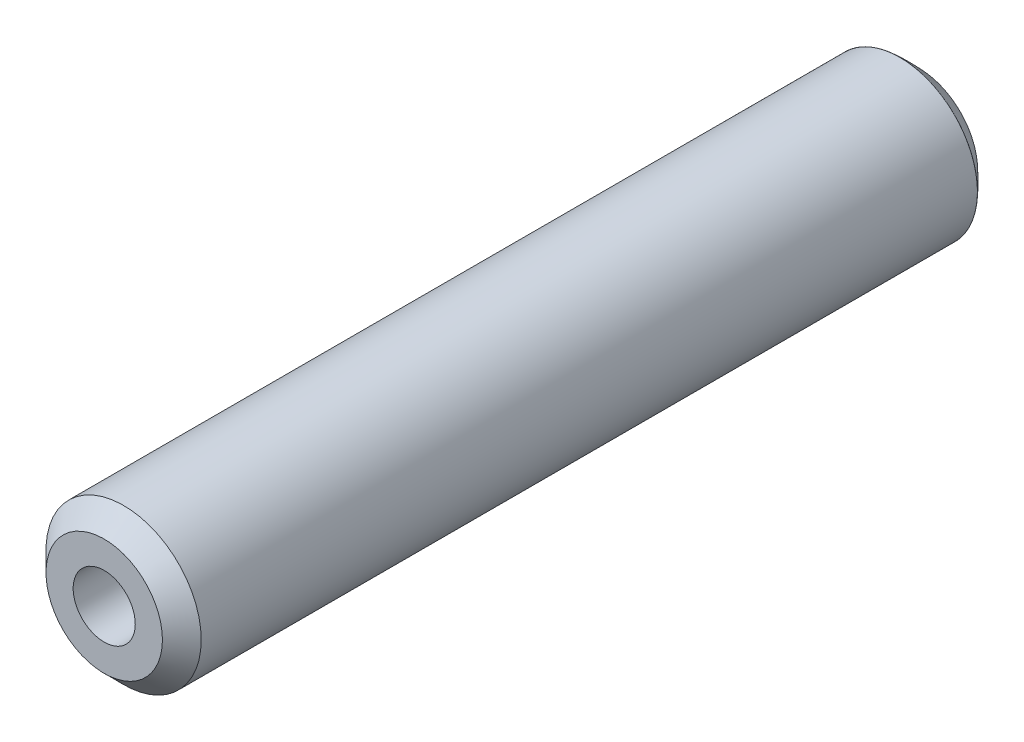
ISO-10303-21;
HEADER;
FILE_DESCRIPTION(('STEP AP214'),'2;1');
FILE_NAME('part.step','',(''),(''),'','','');
FILE_SCHEMA(('AUTOMOTIVE_DESIGN { 1 0 10303 214 1 1 1 1 }'));
ENDSEC;
DATA;
#1=APPLICATION_CONTEXT('core data for automotive mechanical design processes');
#2=APPLICATION_PROTOCOL_DEFINITION('international standard','automotive_design',2000,#1);
#3=PRODUCT_CONTEXT('',#1,'mechanical');
#4=PRODUCT('Part','Part','',(#3));
#5=PRODUCT_RELATED_PRODUCT_CATEGORY('part','',(#4));
#6=PRODUCT_DEFINITION_FORMATION('','',#4);
#7=PRODUCT_DEFINITION_CONTEXT('part definition',#1,'design');
#8=PRODUCT_DEFINITION('design','',#6,#7);
#9=PRODUCT_DEFINITION_SHAPE('','',#8);
#10=(LENGTH_UNIT() NAMED_UNIT(*) SI_UNIT(.MILLI.,.METRE.));
#11=(NAMED_UNIT(*) PLANE_ANGLE_UNIT() SI_UNIT($,.RADIAN.));
#12=(NAMED_UNIT(*) SI_UNIT($,.STERADIAN.) SOLID_ANGLE_UNIT());
#13=UNCERTAINTY_MEASURE_WITH_UNIT(LENGTH_MEASURE(1.E-05),#10,'distance_accuracy_value','');
#14=(GEOMETRIC_REPRESENTATION_CONTEXT(3) GLOBAL_UNCERTAINTY_ASSIGNED_CONTEXT((#13)) GLOBAL_UNIT_ASSIGNED_CONTEXT((#10,
#11,#12)) REPRESENTATION_CONTEXT('',''));
#15=CARTESIAN_POINT('',(0.,0.,0.));
#16=DIRECTION('',(0.,0.,1.));
#17=DIRECTION('',(1.,0.,0.));
#18=AXIS2_PLACEMENT_3D('',#15,#16,#17);
#19=CARTESIAN_POINT('',(-15.,-17.5,-8.));
#20=DIRECTION('',(0.,0.,1.));
#21=DIRECTION('',(1.,0.,0.));
#22=AXIS2_PLACEMENT_3D('',#19,#20,#21);
#23=CYLINDRICAL_SURFACE('',#22,2.);
#24=CARTESIAN_POINT('',(-13.,-17.5,2.5));
#25=CARTESIAN_POINT('',(-12.9999999470683,-17.5327241974965,2.5));
#26=CARTESIAN_POINT('',(-13.0008133145145,-17.5654477404733,2.5));
#27=CARTESIAN_POINT('',(-13.0040514588773,-17.6308145667304,2.5));
#28=CARTESIAN_POINT('',(-13.0064762098141,-17.6634578512962,2.5));
#29=CARTESIAN_POINT('',(-13.0129217490919,-17.728586858663,2.5));
#30=CARTESIAN_POINT('',(-13.0169425662685,-17.7610725786067,2.5));
#31=CARTESIAN_POINT('',(-13.0265648763823,-17.8258096124799,2.5));
#32=CARTESIAN_POINT('',(-13.0321663972611,-17.8580609222555,2.5));
#33=CARTESIAN_POINT('',(-13.0449348270466,-17.9222521602081,2.5));
#34=CARTESIAN_POINT('',(-13.0521017359533,-17.9541920883852,2.5));
#35=CARTESIAN_POINT('',(-13.0679856784994,-18.0176836192475,2.5));
#36=CARTESIAN_POINT('',(-13.0767026847343,-18.0492352287873,2.5));
#37=CARTESIAN_POINT('',(-13.0956715471788,-18.1118731398176,2.5));
#38=CARTESIAN_POINT('',(-13.1059233756553,-18.1429594497045,2.5));
#39=CARTESIAN_POINT('',(-13.1279466255026,-18.204589882949,2.5));
#40=CARTESIAN_POINT('',(-13.1397180713705,-18.2351339975571,2.5));
#41=CARTESIAN_POINT('',(-13.1647637985844,-18.2955997319033,2.5));
#42=CARTESIAN_POINT('',(-13.1780380799305,-18.3255213516415,2.5));
#43=CARTESIAN_POINT('',(-13.2060445879555,-18.3846734382671,2.5));
#44=CARTESIAN_POINT('',(-13.2207767911255,-18.4139039162898,2.5));
#45=CARTESIAN_POINT('',(-13.2516554712828,-18.4716086190359,2.5));
#46=CARTESIAN_POINT('',(-13.2678019738175,-18.5000828300863,2.5));
#47=CARTESIAN_POINT('',(-13.3014656231934,-18.5562097662276,2.5));
#48=CARTESIAN_POINT('',(-13.3189827942595,-18.5838624767875,2.5));
#49=CARTESIAN_POINT('',(-13.3553442074814,-18.6382811773542,2.5));
#50=CARTESIAN_POINT('',(-13.3741884496371,-18.6650471673609,2.5));
#51=CARTESIAN_POINT('',(-13.413160456272,-18.7176271725797,2.5));
#52=CARTESIAN_POINT('',(-13.4332881980557,-18.7434412046119,2.5));
#53=CARTESIAN_POINT('',(-13.4747836325416,-18.7940520189103,2.5));
#54=CARTESIAN_POINT('',(-13.4961513028349,-18.8188488195468,2.5));
#55=CARTESIAN_POINT('',(-13.5400830783593,-18.867359982631,2.5));
#56=CARTESIAN_POINT('',(-13.5626472028745,-18.8910743276207,2.5));
#57=CARTESIAN_POINT('',(-13.6089256723793,-18.9373527971255,2.5));
#58=CARTESIAN_POINT('',(-13.632640017369,-18.9599169216407,2.5));
#59=CARTESIAN_POINT('',(-13.6811511804532,-19.0038486971651,2.5));
#60=CARTESIAN_POINT('',(-13.7059479810897,-19.0252163674584,2.5));
#61=CARTESIAN_POINT('',(-13.7565587953881,-19.0667118019444,2.5));
#62=CARTESIAN_POINT('',(-13.7823728274204,-19.0868395437281,2.5));
#63=CARTESIAN_POINT('',(-13.8349528326392,-19.1258115503629,2.5));
#64=CARTESIAN_POINT('',(-13.8617188226459,-19.1446557925186,2.5));
#65=CARTESIAN_POINT('',(-13.9161375232125,-19.1810172057405,2.5));
#66=CARTESIAN_POINT('',(-13.9437902337723,-19.1985343768067,2.5));
#67=CARTESIAN_POINT('',(-13.999917169914,-19.2321980261825,2.5));
#68=CARTESIAN_POINT('',(-14.0283913809649,-19.2483445287172,2.5));
#69=CARTESIAN_POINT('',(-14.0860960837096,-19.2792232088746,2.5));
#70=CARTESIAN_POINT('',(-14.1153265617303,-19.2939554120449,2.5));
#71=CARTESIAN_POINT('',(-14.1744786483612,-19.3219619200691,2.5));
#72=CARTESIAN_POINT('',(-14.2044002681068,-19.3352362014142,2.5));
#73=CARTESIAN_POINT('',(-14.2648660024329,-19.3602819286309,2.5));
#74=CARTESIAN_POINT('',(-14.2954101170135,-19.3720533745026,2.5));
#75=CARTESIAN_POINT('',(-14.3570405503329,-19.3940766243394,2.5));
#76=CARTESIAN_POINT('',(-14.3881268603222,-19.4043284528016,2.5));
#77=CARTESIAN_POINT('',(-14.4507647710728,-19.4232973152853,2.5));
#78=CARTESIAN_POINT('',(-14.4823163802305,-19.4320143215736,2.5));
#79=CARTESIAN_POINT('',(-14.5458079121367,-19.4478982639735,2.5));
#80=CARTESIAN_POINT('',(-14.5777478417398,-19.4550651726805,2.5));
#81=CARTESIAN_POINT('',(-14.6419390757965,-19.4678336030117,2.5));
#82=CARTESIAN_POINT('',(-14.6741903802501,-19.473435124636,2.5));
#83=CARTESIAN_POINT('',(-14.7389274286631,-19.4830574327131,2.5));
#84=CARTESIAN_POINT('',(-14.7714131684681,-19.4870782471077,2.5));
#85=CARTESIAN_POINT('',(-14.8365421215731,-19.4935237939862,2.5));
#86=CARTESIAN_POINT('',(-14.8691853320174,-19.4959485553054,2.5));
#87=CARTESIAN_POINT('',(-14.9345523607804,-19.4991866713026,2.5));
#88=CARTESIAN_POINT('',(-14.9672761803902,-19.5,2.5));
#89=CARTESIAN_POINT('',(-15.0327238196098,-19.5,2.5));
#90=CARTESIAN_POINT('',(-15.0654476392196,-19.4991866713026,2.5));
#91=CARTESIAN_POINT('',(-15.1308146679825,-19.4959485553054,2.5));
#92=CARTESIAN_POINT('',(-15.1634578784269,-19.4935237939862,2.5));
#93=CARTESIAN_POINT('',(-15.2285868315319,-19.4870782471077,2.5));
#94=CARTESIAN_POINT('',(-15.2610725713369,-19.4830574327131,2.5));
#95=CARTESIAN_POINT('',(-15.3258096197499,-19.473435124636,2.5));
#96=CARTESIAN_POINT('',(-15.3580609242035,-19.4678336030117,2.5));
#97=CARTESIAN_POINT('',(-15.4222521582602,-19.4550651726805,2.5));
#98=CARTESIAN_POINT('',(-15.4541920878634,-19.4478982639735,2.5));
#99=CARTESIAN_POINT('',(-15.5176836197695,-19.4320143215736,2.5));
#100=CARTESIAN_POINT('',(-15.5492352289273,-19.4232973152853,2.5));
#101=CARTESIAN_POINT('',(-15.6118731396778,-19.4043284528016,2.5));
#102=CARTESIAN_POINT('',(-15.6429594496671,-19.3940766243394,2.5));
#103=CARTESIAN_POINT('',(-15.7045898829865,-19.3720533745026,2.5));
#104=CARTESIAN_POINT('',(-15.7351339975671,-19.3602819286309,2.5));
#105=CARTESIAN_POINT('',(-15.7955997318932,-19.3352362014142,2.5));
#106=CARTESIAN_POINT('',(-15.8255213516387,-19.3219619200691,2.5));
#107=CARTESIAN_POINT('',(-15.8846734382697,-19.2939554120449,2.5));
#108=CARTESIAN_POINT('',(-15.9139039162904,-19.2792232088746,2.5));
#109=CARTESIAN_POINT('',(-15.9716086190351,-19.2483445287171,2.5));
#110=CARTESIAN_POINT('',(-16.0000828300861,-19.2321980261824,2.5));
#111=CARTESIAN_POINT('',(-16.0562097662278,-19.1985343768065,2.5));
#112=CARTESIAN_POINT('',(-16.0838624767876,-19.1810172057404,2.5));
#113=CARTESIAN_POINT('',(-16.1382811773542,-19.1446557925184,2.5));
#114=CARTESIAN_POINT('',(-16.165047167361,-19.1258115503627,2.5));
#115=CARTESIAN_POINT('',(-16.2176271725798,-19.0868395437278,2.5));
#116=CARTESIAN_POINT('',(-16.2434412046121,-19.0667118019442,2.5));
#117=CARTESIAN_POINT('',(-16.2940520189105,-19.0252163674582,2.5));
#118=CARTESIAN_POINT('',(-16.3188488195469,-19.003848697165,2.5));
#119=CARTESIAN_POINT('',(-16.3673599826311,-18.9599169216406,2.5));
#120=CARTESIAN_POINT('',(-16.3910743276207,-18.9373527971255,2.5));
#121=CARTESIAN_POINT('',(-16.4373527971255,-18.8910743276207,2.5));
#122=CARTESIAN_POINT('',(-16.4599169216406,-18.8673599826311,2.5));
#123=CARTESIAN_POINT('',(-16.5038486971649,-18.818848819547,2.5));
#124=CARTESIAN_POINT('',(-16.5252163674582,-18.7940520189105,2.5));
#125=CARTESIAN_POINT('',(-16.5667118019441,-18.7434412046122,2.5));
#126=CARTESIAN_POINT('',(-16.5868395437278,-18.7176271725799,2.5));
#127=CARTESIAN_POINT('',(-16.6258115503626,-18.6650471673611,2.5));
#128=CARTESIAN_POINT('',(-16.6446557925184,-18.6382811773543,2.5));
#129=CARTESIAN_POINT('',(-16.6810172057403,-18.5838624767878,2.5));
#130=CARTESIAN_POINT('',(-16.6985343768065,-18.5562097662279,2.5));
#131=CARTESIAN_POINT('',(-16.7321980261823,-18.5000828300862,2.5));
#132=CARTESIAN_POINT('',(-16.748344528717,-18.4716086190353,2.5));
#133=CARTESIAN_POINT('',(-16.7792232088745,-18.4139039162905,2.5));
#134=CARTESIAN_POINT('',(-16.7939554120448,-18.3846734382698,2.5));
#135=CARTESIAN_POINT('',(-16.8219619200691,-18.3255213516388,2.5));
#136=CARTESIAN_POINT('',(-16.8352362014142,-18.2955997318933,2.5));
#137=CARTESIAN_POINT('',(-16.8602819286309,-18.2351339975671,2.5));
#138=CARTESIAN_POINT('',(-16.8720533745026,-18.2045898829865,2.5));
#139=CARTESIAN_POINT('',(-16.8940766243394,-18.142959449667,2.5));
#140=CARTESIAN_POINT('',(-16.9043284528016,-18.1118731396777,2.5));
#141=CARTESIAN_POINT('',(-16.9232973152853,-18.0492352289272,2.5));
#142=CARTESIAN_POINT('',(-16.9320143215737,-18.0176836197694,2.5));
#143=CARTESIAN_POINT('',(-16.9478982639735,-17.9541920878632,2.5));
#144=CARTESIAN_POINT('',(-16.9550651726805,-17.9222521582601,2.5));
#145=CARTESIAN_POINT('',(-16.9678336030117,-17.8580609242034,2.5));
#146=CARTESIAN_POINT('',(-16.973435124636,-17.8258096197499,2.5));
#147=CARTESIAN_POINT('',(-16.9830574327131,-17.7610725713369,2.5));
#148=CARTESIAN_POINT('',(-16.9870782471077,-17.7285868315319,2.5));
#149=CARTESIAN_POINT('',(-16.9935237939862,-17.6634578784269,2.5));
#150=CARTESIAN_POINT('',(-16.9959485553054,-17.6308146679825,2.5));
#151=CARTESIAN_POINT('',(-16.9991866713026,-17.5654476392196,2.5));
#152=CARTESIAN_POINT('',(-17.,-17.5327238196098,2.5));
#153=CARTESIAN_POINT('',(-17.,-17.4672761803902,2.5));
#154=CARTESIAN_POINT('',(-16.9991866713026,-17.4345523607805,2.5));
#155=CARTESIAN_POINT('',(-16.9959485553054,-17.3691853320175,2.5));
#156=CARTESIAN_POINT('',(-16.9935237939862,-17.3365421215732,2.5));
#157=CARTESIAN_POINT('',(-16.9870782471077,-17.2714131684682,2.5));
#158=CARTESIAN_POINT('',(-16.9830574327132,-17.2389274286632,2.5));
#159=CARTESIAN_POINT('',(-16.973435124636,-17.1741903802502,2.5));
#160=CARTESIAN_POINT('',(-16.9678336030118,-17.1419390757966,2.5));
#161=CARTESIAN_POINT('',(-16.9550651726805,-17.0777478417399,2.5));
#162=CARTESIAN_POINT('',(-16.9478982639736,-17.0458079121368,2.5));
#163=CARTESIAN_POINT('',(-16.9320143215737,-16.9823163802306,2.5));
#164=CARTESIAN_POINT('',(-16.9232973152853,-16.9507647710729,2.5));
#165=CARTESIAN_POINT('',(-16.9043284528016,-16.8881268603223,2.5));
#166=CARTESIAN_POINT('',(-16.8940766243394,-16.857040550333,2.5));
#167=CARTESIAN_POINT('',(-16.8720533745026,-16.7954101170136,2.5));
#168=CARTESIAN_POINT('',(-16.8602819286309,-16.7648660024329,2.5));
#169=CARTESIAN_POINT('',(-16.8352362014142,-16.7044002681067,2.5));
#170=CARTESIAN_POINT('',(-16.8219619200691,-16.6744786483612,2.5));
#171=CARTESIAN_POINT('',(-16.7939554120448,-16.6153265617302,2.5));
#172=CARTESIAN_POINT('',(-16.7792232088745,-16.5860960837095,2.5));
#173=CARTESIAN_POINT('',(-16.7483445287171,-16.5283913809648,2.5));
#174=CARTESIAN_POINT('',(-16.7321980261824,-16.4999171699139,2.5));
#175=CARTESIAN_POINT('',(-16.6985343768066,-16.4437902337722,2.5));
#176=CARTESIAN_POINT('',(-16.6810172057405,-16.4161375232124,2.5));
#177=CARTESIAN_POINT('',(-16.6446557925186,-16.3617188226458,2.5));
#178=CARTESIAN_POINT('',(-16.6258115503628,-16.3349528326391,2.5));
#179=CARTESIAN_POINT('',(-16.586839543728,-16.2823728274203,2.5));
#180=CARTESIAN_POINT('',(-16.5667118019443,-16.256558795388,2.5));
#181=CARTESIAN_POINT('',(-16.5252163674584,-16.2059479810897,2.5));
#182=CARTESIAN_POINT('',(-16.5038486971651,-16.1811511804532,2.5));
#183=CARTESIAN_POINT('',(-16.4599169216407,-16.132640017369,2.5));
#184=CARTESIAN_POINT('',(-16.4373527971255,-16.1089256723793,2.5));
#185=CARTESIAN_POINT('',(-16.3910743276207,-16.0626472028745,2.5));
#186=CARTESIAN_POINT('',(-16.367359982631,-16.0400830783593,2.5));
#187=CARTESIAN_POINT('',(-16.3188488195468,-15.9961513028349,2.5));
#188=CARTESIAN_POINT('',(-16.2940520189103,-15.9747836325416,2.5));
#189=CARTESIAN_POINT('',(-16.2434412046119,-15.9332881980557,2.5));
#190=CARTESIAN_POINT('',(-16.2176271725797,-15.913160456272,2.5));
#191=CARTESIAN_POINT('',(-16.1650471673609,-15.8741884496372,2.5));
#192=CARTESIAN_POINT('',(-16.1382811773541,-15.8553442074814,2.5));
#193=CARTESIAN_POINT('',(-16.0838624767876,-15.8189827942595,2.5));
#194=CARTESIAN_POINT('',(-16.0562097662278,-15.8014656231934,2.5));
#195=CARTESIAN_POINT('',(-16.0000828300861,-15.7678019738176,2.5));
#196=CARTESIAN_POINT('',(-15.9716086190352,-15.7516554712829,2.5));
#197=CARTESIAN_POINT('',(-15.9139039162905,-15.7207767911254,2.5));
#198=CARTESIAN_POINT('',(-15.8846734382698,-15.7060445879551,2.5));
#199=CARTESIAN_POINT('',(-15.8255213516388,-15.6780380799309,2.5));
#200=CARTESIAN_POINT('',(-15.7955997318933,-15.6647637985858,2.5));
#201=CARTESIAN_POINT('',(-15.7351339975671,-15.6397180713691,2.5));
#202=CARTESIAN_POINT('',(-15.7045898829865,-15.6279466254974,2.5));
#203=CARTESIAN_POINT('',(-15.642959449667,-15.6059233756606,2.5));
#204=CARTESIAN_POINT('',(-15.6118731396778,-15.5956715471984,2.5));
#205=CARTESIAN_POINT('',(-15.5492352289272,-15.5767026847147,2.5));
#206=CARTESIAN_POINT('',(-15.5176836197695,-15.5679856784263,2.5));
#207=CARTESIAN_POINT('',(-15.4541920878633,-15.5521017360264,2.5));
#208=CARTESIAN_POINT('',(-15.4222521582602,-15.5449348273195,2.5));
#209=CARTESIAN_POINT('',(-15.3580609242036,-15.5321663969883,2.5));
#210=CARTESIAN_POINT('',(-15.32580961975,-15.526564875364,2.5));
#211=CARTESIAN_POINT('',(-15.261072571337,-15.5169425672869,2.5));
#212=CARTESIAN_POINT('',(-15.228586831532,-15.5129217528923,2.5));
#213=CARTESIAN_POINT('',(-15.163457878427,-15.5064762060138,2.5));
#214=CARTESIAN_POINT('',(-15.1308146679826,-15.5040514446946,2.5));
#215=CARTESIAN_POINT('',(-15.0654476392196,-15.5008133286974,2.5));
#216=CARTESIAN_POINT('',(-15.0327238196098,-15.5,2.5));
#217=CARTESIAN_POINT('',(-14.9672761803902,-15.5,2.5));
#218=CARTESIAN_POINT('',(-14.9345523607804,-15.5008133286974,2.5));
#219=CARTESIAN_POINT('',(-14.8691853320173,-15.5040514446946,2.5));
#220=CARTESIAN_POINT('',(-14.836542121573,-15.5064762060138,2.5));
#221=CARTESIAN_POINT('',(-14.771413168468,-15.5129217528923,2.5));
#222=CARTESIAN_POINT('',(-14.738927428663,-15.5169425672869,2.5));
#223=CARTESIAN_POINT('',(-14.67419038025,-15.526564875364,2.5));
#224=CARTESIAN_POINT('',(-14.6419390757964,-15.5321663969883,2.5));
#225=CARTESIAN_POINT('',(-14.5777478417397,-15.5449348273195,2.5));
#226=CARTESIAN_POINT('',(-14.5458079121366,-15.5521017360265,2.5));
#227=CARTESIAN_POINT('',(-14.4823163802305,-15.5679856784264,2.5));
#228=CARTESIAN_POINT('',(-14.4507647710728,-15.5767026847147,2.5));
#229=CARTESIAN_POINT('',(-14.3881268603222,-15.5956715471984,2.5));
#230=CARTESIAN_POINT('',(-14.3570405503329,-15.6059233756606,2.5));
#231=CARTESIAN_POINT('',(-14.2954101170135,-15.6279466254974,2.5));
#232=CARTESIAN_POINT('',(-14.2648660024329,-15.6397180713691,2.5));
#233=CARTESIAN_POINT('',(-14.2044002681067,-15.6647637985858,2.5));
#234=CARTESIAN_POINT('',(-14.1744786483612,-15.6780380799309,2.5));
#235=CARTESIAN_POINT('',(-14.1153265617302,-15.7060445879552,2.5));
#236=CARTESIAN_POINT('',(-14.0860960837095,-15.7207767911255,2.5));
#237=CARTESIAN_POINT('',(-14.0283913809648,-15.7516554712829,2.5));
#238=CARTESIAN_POINT('',(-13.9999171699139,-15.7678019738176,2.5));
#239=CARTESIAN_POINT('',(-13.9437902337721,-15.8014656231935,2.5));
#240=CARTESIAN_POINT('',(-13.9161375232123,-15.8189827942596,2.5));
#241=CARTESIAN_POINT('',(-13.8617188226458,-15.8553442074815,2.5));
#242=CARTESIAN_POINT('',(-13.834952832639,-15.8741884496373,2.5));
#243=CARTESIAN_POINT('',(-13.7823728274202,-15.9131604562721,2.5));
#244=CARTESIAN_POINT('',(-13.7565587953879,-15.9332881980558,2.5));
#245=CARTESIAN_POINT('',(-13.7059479810896,-15.9747836325417,2.5));
#246=CARTESIAN_POINT('',(-13.6811511804531,-15.996151302835,2.5));
#247=CARTESIAN_POINT('',(-13.6326400173689,-16.0400830783594,2.5));
#248=CARTESIAN_POINT('',(-13.6089256723793,-16.0626472028745,2.5));
#249=CARTESIAN_POINT('',(-13.5626472028745,-16.1089256723793,2.5));
#250=CARTESIAN_POINT('',(-13.5400830783594,-16.1326400173689,2.5));
#251=CARTESIAN_POINT('',(-13.496151302835,-16.1811511804531,2.5));
#252=CARTESIAN_POINT('',(-13.4747836325417,-16.2059479810896,2.5));
#253=CARTESIAN_POINT('',(-13.4332881980558,-16.2565587953879,2.5));
#254=CARTESIAN_POINT('',(-13.4131604562721,-16.2823728274202,2.5));
#255=CARTESIAN_POINT('',(-13.3741884496373,-16.334952832639,2.5));
#256=CARTESIAN_POINT('',(-13.3553442074815,-16.3617188226457,2.5));
#257=CARTESIAN_POINT('',(-13.3189827942596,-16.4161375232124,2.5));
#258=CARTESIAN_POINT('',(-13.3014656231935,-16.4437902337723,2.5));
#259=CARTESIAN_POINT('',(-13.2678019738176,-16.4999171699137,2.5));
#260=CARTESIAN_POINT('',(-13.2516554712828,-16.5283913809641,2.5));
#261=CARTESIAN_POINT('',(-13.2207767911256,-16.5860960837102,2.5));
#262=CARTESIAN_POINT('',(-13.2060445879555,-16.6153265617329,2.5));
#263=CARTESIAN_POINT('',(-13.1780380799305,-16.6744786483585,2.5));
#264=CARTESIAN_POINT('',(-13.1647637985844,-16.7044002680967,2.5));
#265=CARTESIAN_POINT('',(-13.1397180713705,-16.764866002443,2.5));
#266=CARTESIAN_POINT('',(-13.1279466255026,-16.795410117051,2.5));
#267=CARTESIAN_POINT('',(-13.1059233756553,-16.8570405502955,2.5));
#268=CARTESIAN_POINT('',(-13.0956715471788,-16.8881268601824,2.5));
#269=CARTESIAN_POINT('',(-13.0767026847342,-16.9507647712127,2.5));
#270=CARTESIAN_POINT('',(-13.0679856784994,-16.9823163807526,2.5));
#271=CARTESIAN_POINT('',(-13.0521017359533,-17.0458079116148,2.5));
#272=CARTESIAN_POINT('',(-13.0449348270466,-17.0777478397919,2.5));
#273=CARTESIAN_POINT('',(-13.0321663972611,-17.1419390777446,2.5));
#274=CARTESIAN_POINT('',(-13.0265648763823,-17.1741903875201,2.5));
#275=CARTESIAN_POINT('',(-13.0169425662685,-17.2389274213933,2.5));
#276=CARTESIAN_POINT('',(-13.0129217490919,-17.271413141337,2.5));
#277=CARTESIAN_POINT('',(-13.0064762098141,-17.3365421487038,2.5));
#278=CARTESIAN_POINT('',(-13.0040514588773,-17.3691854332696,2.5));
#279=CARTESIAN_POINT('',(-13.0008133145145,-17.4345522595267,2.5));
#280=CARTESIAN_POINT('',(-12.9999999470683,-17.4672758025035,2.5));
#281=CARTESIAN_POINT('',(-13.,-17.5,2.5));
#282=B_SPLINE_CURVE_WITH_KNOTS('',3,(#24,#25,#26,#27,#28,#29,#30,#31,#32,#33,#34,#35,#36,#37,
#38,#39,#40,#41,#42,#43,#44,#45,#46,#47,#48,#49,#50,#51,#52,#53,#54,#55,#56,#57,#58,#59,#60,#61,
#62,#63,#64,#65,#66,#67,#68,#69,#70,#71,#72,#73,#74,#75,#76,#77,#78,#79,#80,#81,#82,#83,#84,#85,
#86,#87,#88,#89,#90,#91,#92,#93,#94,#95,#96,#97,#98,#99,#100,#101,#102,#103,#104,#105,#106,#107,
#108,#109,#110,#111,#112,#113,#114,#115,#116,#117,#118,#119,#120,#121,#122,#123,#124,#125,#126,
#127,#128,#129,#130,#131,#132,#133,#134,#135,#136,#137,#138,#139,#140,#141,#142,#143,#144,#145,
#146,#147,#148,#149,#150,#151,#152,#153,#154,#155,#156,#157,#158,#159,#160,#161,#162,#163,#164,
#165,#166,#167,#168,#169,#170,#171,#172,#173,#174,#175,#176,#177,#178,#179,#180,#181,#182,#183,
#184,#185,#186,#187,#188,#189,#190,#191,#192,#193,#194,#195,#196,#197,#198,#199,#200,#201,#202,
#203,#204,#205,#206,#207,#208,#209,#210,#211,#212,#213,#214,#215,#216,#217,#218,#219,#220,#221,
#222,#223,#224,#225,#226,#227,#228,#229,#230,#231,#232,#233,#234,#235,#236,#237,#238,#239,#240,
#241,#242,#243,#244,#245,#246,#247,#248,#249,#250,#251,#252,#253,#254,#255,#256,#257,#258,#259,
#260,#261,#262,#263,#264,#265,#266,#267,#268,#269,#270,#271,#272,#273,#274,#275,#276,#277,#278,
#279,#280,#281),.UNSPECIFIED.,.F.,.F.,(4,2,2,2,2,2,2,2,2,2,2,2,2,2,2,2,2,2,2,2,2,2,2,2,2,2,2,2,
2,2,2,2,2,2,2,2,2,2,2,2,2,2,2,2,2,2,2,2,2,2,2,2,2,2,2,2,2,2,2,2,2,2,2,2,2,2,2,2,2,2,2,2,2,2,2,2,
2,2,2,2,2,2,2,2,2,2,2,2,2,2,2,2,2,2,2,2,2,2,2,2,2,2,2,2,2,2,2,2,2,2,2,2,2,2,2,2,2,2,2,2,2,2,2,2,
2,2,2,2,4),(0.,0.0981615585893566,0.196321534588035,0.294483284087453,0.392646768874277,
0.490810253661114,0.588972003160559,0.68713197915929,0.785293537748715,0.883455096338132,
0.981615072336836,1.07977682183625,1.17794030662306,1.27610379140988,1.3742655409093,
1.472425516908,1.57058707549743,1.66874863408687,1.76690861008559,1.86507035958504,
1.96323384437187,2.06139732915869,2.1595590786581,2.25771905465677,2.35588061324614,
2.45404217183551,2.55220214783421,2.65036389733365,2.74852738212049,2.84669086690734,
2.94485261640678,3.04301259240547,3.14117415099485,3.23933570958422,3.33749568558293,
3.43565743508239,3.53382091986925,3.63198440465611,3.73014615415554,3.82830613015422,
3.92646768874356,4.02462924733292,4.12278922333164,4.22095097283114,4.31911445761804,
4.41727794240493,4.51543969190438,4.61359966790302,4.71176122649225,4.80992278508147,
4.90808276108008,5.00624451057949,5.10440799536635,5.20257148015324,5.30073322965274,
5.39889320565152,5.49705476424096,5.59521632283039,5.69337629882911,5.79153804832855,
5.88970153311538,5.9878650179022,6.08602676740162,6.1841867434003,6.28234830198967,
6.38050986057903,6.47866983657769,6.57683158607709,6.67499507086391,6.77315855565073,
6.87132030515018,6.96948028114892,7.06764183973838,7.16580339832784,7.26396337432656,
7.36212512382598,7.46028860861278,7.55845209339957,7.65661384289898,7.75477381889767,
7.8529353774871,7.95109693607652,8.04925691207524,8.14741866157465,8.24558214636147,
8.34374563114827,8.44190738064769,8.5400673566464,8.63822891523581,8.73639047382523,
8.83455044982392,8.93271219932332,9.03087568411011,9.12903916889692,9.22720091839634,
9.32536089439506,9.42352245298453,9.52168401157399,9.61984398757272,9.71800573707215,
9.81616922185895,9.91433270664575,10.0124944561452,10.1106544321438,10.2088159907332,
10.3069775493227,10.4051375253214,10.5032992748209,10.6014627596077,10.6996262443946,
10.797787993894,10.8959479698926,10.994109528482,11.0922710870713,11.1904310630699,
11.2885928125693,11.3867562973562,11.484919782143,11.5830815316425,11.6812415076412,
11.7794030662307,11.8775646248201,11.9757246008188,12.0738863503183,12.1720498351051,
12.2702133198919,12.3683750693913,12.46653504539,12.5646966039794),.UNSPECIFIED.);
#283=CARTESIAN_POINT('',(-13.,-17.5,2.5));
#284=VERTEX_POINT('',#283);
#285=EDGE_CURVE('E57',#284,#284,#282,.F.);
#286=ORIENTED_EDGE('',*,*,#285,.T.);
#287=EDGE_LOOP('',(#286));
#288=FACE_BOUND('',#287,.T.);
#289=CARTESIAN_POINT('',(-15.,-17.5,22.5));
#290=DIRECTION('',(0.,0.,1.));
#291=DIRECTION('',(1.,0.,0.));
#292=AXIS2_PLACEMENT_3D('',#289,#290,#291);
#293=CIRCLE('',#292,2.);
#294=CARTESIAN_POINT('',(-13.,-17.5,22.5));
#295=VERTEX_POINT('',#294);
#296=EDGE_CURVE('E73',#295,#295,#293,.F.);
#297=ORIENTED_EDGE('',*,*,#296,.T.);
#298=EDGE_LOOP('',(#297));
#299=FACE_BOUND('',#298,.T.);
#300=ADVANCED_FACE('F44',(#288,#299),#23,.T.);
#301=CARTESIAN_POINT('',(-15.,-17.5,23.));
#302=DIRECTION('',(0.,0.,1.));
#303=DIRECTION('',(1.,0.,0.));
#304=AXIS2_PLACEMENT_3D('',#301,#302,#303);
#305=PLANE('',#304);
#306=CARTESIAN_POINT('',(-15.,-17.5,23.));
#307=DIRECTION('',(0.,0.,1.));
#308=DIRECTION('',(1.,0.,0.));
#309=AXIS2_PLACEMENT_3D('',#306,#307,#308);
#310=CIRCLE('',#309,0.79999999999999);
#311=CARTESIAN_POINT('',(-14.2,-17.5,23.));
#312=VERTEX_POINT('',#311);
#313=EDGE_CURVE('E87',#312,#312,#310,.T.);
#314=ORIENTED_EDGE('',*,*,#313,.F.);
#315=EDGE_LOOP('',(#314));
#316=FACE_BOUND('',#315,.T.);
#317=CARTESIAN_POINT('',(-15.,-17.5,23.));
#318=DIRECTION('',(0.,0.,1.));
#319=DIRECTION('',(1.,0.,0.));
#320=AXIS2_PLACEMENT_3D('',#317,#318,#319);
#321=CIRCLE('',#320,1.5);
#322=CARTESIAN_POINT('',(-13.5,-17.5,23.));
#323=VERTEX_POINT('',#322);
#324=EDGE_CURVE('E77',#323,#323,#321,.T.);
#325=ORIENTED_EDGE('',*,*,#324,.T.);
#326=EDGE_LOOP('',(#325));
#327=FACE_BOUND('',#326,.T.);
#328=ADVANCED_FACE('F108',(#316,#327),#305,.T.);
#329=CARTESIAN_POINT('',(-15.,-17.5,23.));
#330=DIRECTION('',(0.,0.,-1.));
#331=DIRECTION('',(-1.,0.,0.));
#332=AXIS2_PLACEMENT_3D('',#329,#330,#331);
#333=CONICAL_SURFACE('',#332,1.5,0.785398163397441);
#334=ORIENTED_EDGE('',*,*,#296,.F.);
#335=EDGE_LOOP('',(#334));
#336=FACE_BOUND('',#335,.T.);
#337=ORIENTED_EDGE('',*,*,#324,.F.);
#338=EDGE_LOOP('',(#337));
#339=FACE_BOUND('',#338,.T.);
#340=ADVANCED_FACE('F109',(#336,#339),#333,.T.);
#341=CARTESIAN_POINT('',(-15.,-17.5,16.));
#342=DIRECTION('',(0.,0.,1.));
#343=DIRECTION('',(1.,0.,0.));
#344=AXIS2_PLACEMENT_3D('',#341,#342,#343);
#345=CONICAL_SURFACE('',#344,0.799999999999988,1.02974425867665);
#346=CARTESIAN_POINT('',(-15.,-17.5,15.5193115047779));
#347=VERTEX_POINT('',#346);
#348=VERTEX_LOOP('',#347);
#349=FACE_BOUND('',#348,.T.);
#350=CARTESIAN_POINT('',(-15.,-17.5,16.));
#351=DIRECTION('',(0.,0.,1.));
#352=DIRECTION('',(1.,0.,0.));
#353=AXIS2_PLACEMENT_3D('',#350,#351,#352);
#354=CIRCLE('',#353,0.799999999999988);
#355=CARTESIAN_POINT('',(-14.2,-17.5,16.));
#356=VERTEX_POINT('',#355);
#357=EDGE_CURVE('E83',#356,#356,#354,.T.);
#358=ORIENTED_EDGE('',*,*,#357,.T.);
#359=EDGE_LOOP('',(#358));
#360=FACE_BOUND('',#359,.T.);
#361=ADVANCED_FACE('F113',(#349,#360),#345,.F.);
#362=CARTESIAN_POINT('',(-15.,-17.5,23.));
#363=DIRECTION('',(0.,0.,1.));
#364=DIRECTION('',(1.,0.,0.));
#365=AXIS2_PLACEMENT_3D('',#362,#363,#364);
#366=CYLINDRICAL_SURFACE('',#365,0.799999999999989);
#367=ORIENTED_EDGE('',*,*,#357,.F.);
#368=EDGE_LOOP('',(#367));
#369=FACE_BOUND('',#368,.T.);
#370=ORIENTED_EDGE('',*,*,#313,.T.);
#371=EDGE_LOOP('',(#370));
#372=FACE_BOUND('',#371,.T.);
#373=ADVANCED_FACE('F116',(#369,#372),#366,.F.);
#374=CARTESIAN_POINT('',(0.,0.,2.));
#375=DIRECTION('',(0.,0.,1.));
#376=DIRECTION('',(1.,0.,0.));
#377=AXIS2_PLACEMENT_3D('',#374,#375,#376);
#378=PLANE('',#377);
#379=CARTESIAN_POINT('',(-13.5,-17.5,2.));
#380=CARTESIAN_POINT('',(-13.5,-17.3036504736953,2.));
#381=CARTESIAN_POINT('',(-13.5390409905634,-17.1073781600239,2.));
#382=CARTESIAN_POINT('',(-13.6893204119028,-16.7445715428809,2.));
#383=CARTESIAN_POINT('',(-13.8004997466871,-16.578179909753,2.));
#384=CARTESIAN_POINT('',(-14.0781799097533,-16.3004997466874,2.));
#385=CARTESIAN_POINT('',(-14.2445715428808,-16.1893204119029,2.));
#386=CARTESIAN_POINT('',(-14.6073781600239,-16.0390409905632,2.));
#387=CARTESIAN_POINT('',(-14.8036504736949,-16.,2.));
#388=CARTESIAN_POINT('',(-15.1963495263051,-16.,2.));
#389=CARTESIAN_POINT('',(-15.3926218399761,-16.0390409905635,2.));
#390=CARTESIAN_POINT('',(-15.7554284571192,-16.1893204119026,2.));
#391=CARTESIAN_POINT('',(-15.9218200902467,-16.300499746687,2.));
#392=CARTESIAN_POINT('',(-16.199500253313,-16.5781799097533,2.));
#393=CARTESIAN_POINT('',(-16.3106795880971,-16.7445715428808,2.));
#394=CARTESIAN_POINT('',(-16.4609590094368,-17.1073781600239,2.));
#395=CARTESIAN_POINT('',(-16.5,-17.3036504736952,2.));
#396=CARTESIAN_POINT('',(-16.5,-17.6963495263048,2.));
#397=CARTESIAN_POINT('',(-16.4609590094365,-17.8926218399761,2.));
#398=CARTESIAN_POINT('',(-16.3106795880974,-18.2554284571192,2.));
#399=CARTESIAN_POINT('',(-16.1995002533126,-18.421820090247,2.));
#400=CARTESIAN_POINT('',(-15.921820090247,-18.6995002533126,2.));
#401=CARTESIAN_POINT('',(-15.755428457119,-18.8106795880974,2.));
#402=CARTESIAN_POINT('',(-15.3926218399763,-18.9609590094365,2.));
#403=CARTESIAN_POINT('',(-15.1963495263049,-19.,2.));
#404=CARTESIAN_POINT('',(-14.8036504736951,-19.,2.));
#405=CARTESIAN_POINT('',(-14.6073781600237,-18.9609590094368,2.));
#406=CARTESIAN_POINT('',(-14.244571542881,-18.8106795880971,2.));
#407=CARTESIAN_POINT('',(-14.0781799097531,-18.699500253313,2.));
#408=CARTESIAN_POINT('',(-13.8004997466872,-18.4218200902467,2.));
#409=CARTESIAN_POINT('',(-13.6893204119026,-18.2554284571192,2.));
#410=CARTESIAN_POINT('',(-13.5390409905635,-17.8926218399761,2.));
#411=CARTESIAN_POINT('',(-13.5,-17.6963495263047,2.));
#412=CARTESIAN_POINT('',(-13.5,-17.5,2.));
#413=(BOUNDED_CURVE() B_SPLINE_CURVE(3,(#379,#380,#381,#382,#383,#384,#385,#386,#387,#388,#389,
#390,#391,#392,#393,#394,#395,#396,#397,#398,#399,#400,#401,#402,#403,#404,#405,#406,#407,#408,
#409,#410,#411,#412),.UNSPECIFIED.,.T.,.F.) B_SPLINE_CURVE_WITH_KNOTS((4,2,2,2,2,2,2,2,2,2,2,2,
2,2,2,2,4),(0.,0.392699081698724,0.785398163397448,1.17809724509617,1.5707963267949,
1.96349540849362,2.35619449019234,2.74889357189107,3.14159265358979,3.53429173528852,
3.92699081698724,4.31968989868597,4.71238898038469,5.10508806208341,5.49778714378214,
5.89048622548086,6.28318530717959),
.UNSPECIFIED.) CURVE() GEOMETRIC_REPRESENTATION_ITEM() RATIONAL_B_SPLINE_CURVE((0.999999999999786,
0.999999999999786,0.999999999999786,0.999999999999786,0.999999999999786,0.999999999999786,
0.999999999999786,0.999999999999786,0.999999999999786,0.999999999999786,0.999999999999786,
0.999999999999786,0.999999999999786,0.999999999999786,0.999999999999786,0.999999999999786,
0.999999999999786,0.999999999999786,0.999999999999786,0.999999999999786,0.999999999999786,
0.999999999999786,0.999999999999786,0.999999999999786,0.999999999999786,0.999999999999786,
0.999999999999786,0.999999999999786,0.999999999999786,0.999999999999786,0.999999999999786,
0.999999999999786,0.999999999999786,0.999999999999786)) REPRESENTATION_ITEM(''));
#414=CARTESIAN_POINT('',(-13.5,-17.5,2.));
#415=VERTEX_POINT('',#414);
#416=EDGE_CURVE('E13',#415,#415,#413,.F.);
#417=ORIENTED_EDGE('',*,*,#416,.T.);
#418=EDGE_LOOP('',(#417));
#419=FACE_BOUND('',#418,.T.);
#420=CARTESIAN_POINT('',(-15.,-17.5,2.));
#421=DIRECTION('',(0.,0.,-1.));
#422=DIRECTION('',(-1.,0.,0.));
#423=AXIS2_PLACEMENT_3D('',#420,#421,#422);
#424=CIRCLE('',#423,0.79999999999999);
#425=CARTESIAN_POINT('',(-15.8,-17.5,2.));
#426=VERTEX_POINT('',#425);
#427=EDGE_CURVE('E74',#426,#426,#424,.T.);
#428=ORIENTED_EDGE('',*,*,#427,.F.);
#429=EDGE_LOOP('',(#428));
#430=FACE_BOUND('',#429,.T.);
#431=ADVANCED_FACE('F67',(#419,#430),#378,.F.);
#432=CARTESIAN_POINT('',(-15.,-17.5,8.99999999999999));
#433=DIRECTION('',(0.,0.,-1.));
#434=DIRECTION('',(-1.,0.,0.));
#435=AXIS2_PLACEMENT_3D('',#432,#433,#434);
#436=CONICAL_SURFACE('',#435,0.799999999999988,1.02974425867664);
#437=CARTESIAN_POINT('',(-15.,-17.5,9.48068849522205));
#438=VERTEX_POINT('',#437);
#439=VERTEX_LOOP('',#438);
#440=FACE_BOUND('',#439,.T.);
#441=CARTESIAN_POINT('',(-15.,-17.5,8.99999999999999));
#442=DIRECTION('',(0.,0.,-1.));
#443=DIRECTION('',(-1.,0.,0.));
#444=AXIS2_PLACEMENT_3D('',#441,#442,#443);
#445=CIRCLE('',#444,0.799999999999988);
#446=CARTESIAN_POINT('',(-15.8,-17.5,8.99999999999999));
#447=VERTEX_POINT('',#446);
#448=EDGE_CURVE('E71',#447,#447,#445,.T.);
#449=ORIENTED_EDGE('',*,*,#448,.T.);
#450=EDGE_LOOP('',(#449));
#451=FACE_BOUND('',#450,.T.);
#452=ADVANCED_FACE('F63',(#440,#451),#436,.F.);
#453=CARTESIAN_POINT('',(-15.,-17.5,2.));
#454=DIRECTION('',(0.,0.,-1.));
#455=DIRECTION('',(-1.,0.,0.));
#456=AXIS2_PLACEMENT_3D('',#453,#454,#455);
#457=CYLINDRICAL_SURFACE('',#456,0.799999999999989);
#458=ORIENTED_EDGE('',*,*,#448,.F.);
#459=EDGE_LOOP('',(#458));
#460=FACE_BOUND('',#459,.T.);
#461=ORIENTED_EDGE('',*,*,#427,.T.);
#462=EDGE_LOOP('',(#461));
#463=FACE_BOUND('',#462,.T.);
#464=ADVANCED_FACE('F66',(#460,#463),#457,.F.);
#465=CARTESIAN_POINT('',(-13.,-17.5,2.5));
#466=CARTESIAN_POINT('',(-13.,-17.2382006315935,2.5));
#467=CARTESIAN_POINT('',(-13.0520546540845,-16.9765042133653,2.5));
#468=CARTESIAN_POINT('',(-13.2524272158703,-16.4927620571744,2.5));
#469=CARTESIAN_POINT('',(-13.4006663289164,-16.2709065463374,2.5));
#470=CARTESIAN_POINT('',(-13.7709065463374,-15.9006663289164,2.5));
#471=CARTESIAN_POINT('',(-13.9927620571745,-15.7524272158703,2.5));
#472=CARTESIAN_POINT('',(-14.4765042133652,-15.5520546540845,2.5));
#473=CARTESIAN_POINT('',(-14.7382006315931,-15.5,2.5));
#474=CARTESIAN_POINT('',(-15.2617993684069,-15.5,2.5));
#475=CARTESIAN_POINT('',(-15.5234957866348,-15.5520546540845,2.5));
#476=CARTESIAN_POINT('',(-16.0072379428256,-15.7524272158703,2.5));
#477=CARTESIAN_POINT('',(-16.2290934536623,-15.9006663289161,2.5));
#478=CARTESIAN_POINT('',(-16.5993336710839,-16.2709065463377,2.5));
#479=CARTESIAN_POINT('',(-16.7475727841296,-16.4927620571743,2.5));
#480=CARTESIAN_POINT('',(-16.9479453459155,-16.9765042133653,2.5));
#481=CARTESIAN_POINT('',(-17.,-17.2382006315934,2.5));
#482=CARTESIAN_POINT('',(-17.,-17.7617993684066,2.5));
#483=CARTESIAN_POINT('',(-16.9479453459155,-18.0234957866348,2.5));
#484=CARTESIAN_POINT('',(-16.7475727841297,-18.5072379428256,2.5));
#485=CARTESIAN_POINT('',(-16.5993336710834,-18.7290934536628,2.5));
#486=CARTESIAN_POINT('',(-16.2290934536628,-19.0993336710834,2.5));
#487=CARTESIAN_POINT('',(-16.0072379428253,-19.2475727841298,2.5));
#488=CARTESIAN_POINT('',(-15.5234957866351,-19.4479453459154,2.5));
#489=CARTESIAN_POINT('',(-15.2617993684066,-19.5,2.5));
#490=CARTESIAN_POINT('',(-14.7382006315934,-19.5,2.5));
#491=CARTESIAN_POINT('',(-14.476504213365,-19.4479453459154,2.5));
#492=CARTESIAN_POINT('',(-13.9927620571746,-19.2475727841297,2.5));
#493=CARTESIAN_POINT('',(-13.7709065463377,-19.0993336710839,2.5));
#494=CARTESIAN_POINT('',(-13.4006663289161,-18.7290934536623,2.5));
#495=CARTESIAN_POINT('',(-13.2524272158703,-18.5072379428256,2.5));
#496=CARTESIAN_POINT('',(-13.0520546540845,-18.0234957866348,2.5));
#497=CARTESIAN_POINT('',(-13.,-17.7617993684065,2.5));
#498=CARTESIAN_POINT('',(-13.,-17.5,2.5));
#499=CARTESIAN_POINT('',(-13.,-17.5,2.));
#500=CARTESIAN_POINT('',(-13.0000000000002,-17.2382006315935,2.00000000000004));
#501=CARTESIAN_POINT('',(-13.0520546540846,-16.9765042133653,2.));
#502=CARTESIAN_POINT('',(-13.2524272158703,-16.4927620571744,2.));
#503=CARTESIAN_POINT('',(-13.4006663289161,-16.2709065463372,2.));
#504=CARTESIAN_POINT('',(-13.7709065463377,-15.9006663289167,2.));
#505=CARTESIAN_POINT('',(-13.9927620571745,-15.7524272158705,2.));
#506=CARTESIAN_POINT('',(-14.4765042133651,-15.5520546540844,2.));
#507=CARTESIAN_POINT('',(-14.7382006315929,-15.5,2.));
#508=CARTESIAN_POINT('',(-15.2617993684071,-15.5,2.));
#509=CARTESIAN_POINT('',(-15.5234957866344,-15.5520546540847,1.99999999999996));
#510=CARTESIAN_POINT('',(-16.007237942826,-15.7524272158701,2.00000000000004));
#511=CARTESIAN_POINT('',(-16.2290934536621,-15.9006663289163,2.));
#512=CARTESIAN_POINT('',(-16.5993336710841,-16.2709065463375,2.));
#513=CARTESIAN_POINT('',(-16.7475727841295,-16.4927620571743,2.));
#514=CARTESIAN_POINT('',(-16.9479453459156,-16.9765042133653,2.));
#515=CARTESIAN_POINT('',(-17.,-17.2382006315934,2.));
#516=CARTESIAN_POINT('',(-17.,-17.7617993684066,2.));
#517=CARTESIAN_POINT('',(-16.9479453459153,-18.0234957866347,2.));
#518=CARTESIAN_POINT('',(-16.7475727841299,-18.5072379428257,2.));
#519=CARTESIAN_POINT('',(-16.5993336710834,-18.7290934536628,2.));
#520=CARTESIAN_POINT('',(-16.2290934536628,-19.0993336710834,2.));
#521=CARTESIAN_POINT('',(-16.0072379428253,-19.2475727841299,2.));
#522=CARTESIAN_POINT('',(-15.523495786635,-19.4479453459153,2.));
#523=CARTESIAN_POINT('',(-15.2617993684067,-19.5,2.));
#524=CARTESIAN_POINT('',(-14.7382006315932,-19.5,2.));
#525=CARTESIAN_POINT('',(-14.4765042133649,-19.4479453459156,2.));
#526=CARTESIAN_POINT('',(-13.9927620571747,-19.2475727841295,2.));
#527=CARTESIAN_POINT('',(-13.7709065463374,-19.0993336710841,2.00000000000013));
#528=CARTESIAN_POINT('',(-13.4006663289164,-18.7290934536621,1.99999999999987));
#529=CARTESIAN_POINT('',(-13.2524272158701,-18.5072379428257,2.));
#530=CARTESIAN_POINT('',(-13.0520546540847,-18.0234957866347,2.));
#531=CARTESIAN_POINT('',(-12.9999999999998,-17.7617993684065,1.99999999999996));
#532=CARTESIAN_POINT('',(-13.,-17.5,2.));
#533=CARTESIAN_POINT('',(-13.5,-17.5,2.));
#534=CARTESIAN_POINT('',(-13.5,-17.3036504736953,2.));
#535=CARTESIAN_POINT('',(-13.5390409905634,-17.1073781600239,2.));
#536=CARTESIAN_POINT('',(-13.6893204119028,-16.7445715428809,2.));
#537=CARTESIAN_POINT('',(-13.8004997466871,-16.578179909753,2.));
#538=CARTESIAN_POINT('',(-14.0781799097533,-16.3004997466874,2.));
#539=CARTESIAN_POINT('',(-14.2445715428808,-16.1893204119029,2.));
#540=CARTESIAN_POINT('',(-14.6073781600239,-16.0390409905632,2.));
#541=CARTESIAN_POINT('',(-14.8036504736949,-16.,2.));
#542=CARTESIAN_POINT('',(-15.1963495263051,-16.,2.));
#543=CARTESIAN_POINT('',(-15.3926218399761,-16.0390409905635,2.));
#544=CARTESIAN_POINT('',(-15.7554284571191,-16.1893204119026,2.));
#545=CARTESIAN_POINT('',(-15.9218200902467,-16.300499746687,2.));
#546=CARTESIAN_POINT('',(-16.199500253313,-16.5781799097533,2.));
#547=CARTESIAN_POINT('',(-16.3106795880971,-16.7445715428808,2.));
#548=CARTESIAN_POINT('',(-16.4609590094368,-17.1073781600239,2.));
#549=CARTESIAN_POINT('',(-16.5,-17.3036504736952,2.));
#550=CARTESIAN_POINT('',(-16.5,-17.6963495263048,2.));
#551=CARTESIAN_POINT('',(-16.4609590094365,-17.8926218399761,2.));
#552=CARTESIAN_POINT('',(-16.3106795880974,-18.2554284571192,2.));
#553=CARTESIAN_POINT('',(-16.1995002533126,-18.421820090247,2.));
#554=CARTESIAN_POINT('',(-15.921820090247,-18.6995002533126,2.));
#555=CARTESIAN_POINT('',(-15.755428457119,-18.8106795880974,2.));
#556=CARTESIAN_POINT('',(-15.3926218399763,-18.9609590094365,2.));
#557=CARTESIAN_POINT('',(-15.1963495263049,-19.,2.));
#558=CARTESIAN_POINT('',(-14.8036504736951,-19.,2.));
#559=CARTESIAN_POINT('',(-14.6073781600237,-18.9609590094368,2.));
#560=CARTESIAN_POINT('',(-14.244571542881,-18.8106795880971,2.));
#561=CARTESIAN_POINT('',(-14.0781799097531,-18.699500253313,2.));
#562=CARTESIAN_POINT('',(-13.8004997466872,-18.4218200902467,2.));
#563=CARTESIAN_POINT('',(-13.6893204119026,-18.2554284571192,2.));
#564=CARTESIAN_POINT('',(-13.5390409905635,-17.8926218399761,2.));
#565=CARTESIAN_POINT('',(-13.5,-17.6963495263047,2.));
#566=CARTESIAN_POINT('',(-13.5,-17.5,2.));
#567=(BOUNDED_SURFACE() B_SPLINE_SURFACE(2,3,((#465,#466,#467,#468,#469,#470,#471,#472,#473,
#474,#475,#476,#477,#478,#479,#480,#481,#482,#483,#484,#485,#486,#487,#488,#489,#490,#491,#492,
#493,#494,#495,#496,#497,#498),(#499,#500,#501,#502,#503,#504,#505,#506,#507,#508,#509,#510,
#511,#512,#513,#514,#515,#516,#517,#518,#519,#520,#521,#522,#523,#524,#525,#526,#527,#528,#529,
#530,#531,#532),(#533,#534,#535,#536,#537,#538,#539,#540,#541,#542,#543,#544,#545,#546,#547,
#548,#549,#550,#551,#552,#553,#554,#555,#556,#557,#558,#559,#560,#561,#562,#563,#564,#565,
#566)),.UNSPECIFIED.,.F.,.T.,.F.) B_SPLINE_SURFACE_WITH_KNOTS((3,3),(4,2,2,2,2,2,2,2,2,2,2,2,2,
2,2,2,4),(0.,1.),(0.,0.392699081698724,0.785398163397448,1.17809724509617,1.5707963267949,
1.96349540849362,2.35619449019234,2.74889357189107,3.14159265358979,3.53429173528852,
3.92699081698724,4.31968989868597,4.71238898038469,5.10508806208341,5.49778714378214,
5.89048622548086,6.28318530717959),
.UNSPECIFIED.) GEOMETRIC_REPRESENTATION_ITEM() RATIONAL_B_SPLINE_SURFACE(((1.,1.,1.,1.,1.,1.,1.,
1.,1.,1.,1.,1.,1.,1.,1.,1.,1.,1.,1.,1.,1.,1.,1.,1.,1.,1.,1.,1.,1.,1.,1.,1.,1.,1.),
(0.0353553390593273,0.0353553390593273,0.0353553390593275,0.0353553390593275,0.0353553390593274,
0.0353553390593274,0.0353553390593274,0.0353553390593274,0.0353553390593274,0.0353553390593274,
0.0353553390593274,0.0353553390593274,0.0353553390593273,0.0353553390593273,0.0353553390593274,
0.0353553390593274,0.0353553390593274,0.0353553390593274,0.0353553390593274,0.0353553390593274,
0.0353553390593273,0.0353553390593273,0.0353553390593274,0.0353553390593274,0.0353553390593274,
0.0353553390593274,0.0353553390593274,0.0353553390593274,0.0353553390593274,0.0353553390593274,
0.0353553390593275,0.0353553390593275,0.0353553390593273,0.0353553390593273),(1.,1.,1.,1.,1.,1.,
1.,1.,1.,1.,1.,1.,1.,1.,1.,1.,1.,1.,1.,1.,1.,1.,1.,1.,1.,1.,1.,1.,1.,1.,1.,1.,1.,1.))) REPRESENTATION_ITEM('') SURFACE());
#568=ORIENTED_EDGE('',*,*,#416,.F.);
#569=EDGE_LOOP('',(#568));
#570=FACE_BOUND('',#569,.T.);
#571=ORIENTED_EDGE('',*,*,#285,.F.);
#572=EDGE_LOOP('',(#571));
#573=FACE_BOUND('',#572,.T.);
#574=ADVANCED_FACE('F46',(#570,#573),#567,.T.);
#575=CLOSED_SHELL('',(#300,#328,#340,#361,#373,#431,#452,#464,#574));
#576=MANIFOLD_SOLID_BREP('B2',#575);
#577=ADVANCED_BREP_SHAPE_REPRESENTATION('',(#18,#576),#14);
#578=SHAPE_DEFINITION_REPRESENTATION(#9,#577);
ENDSEC;
END-ISO-10303-21;
